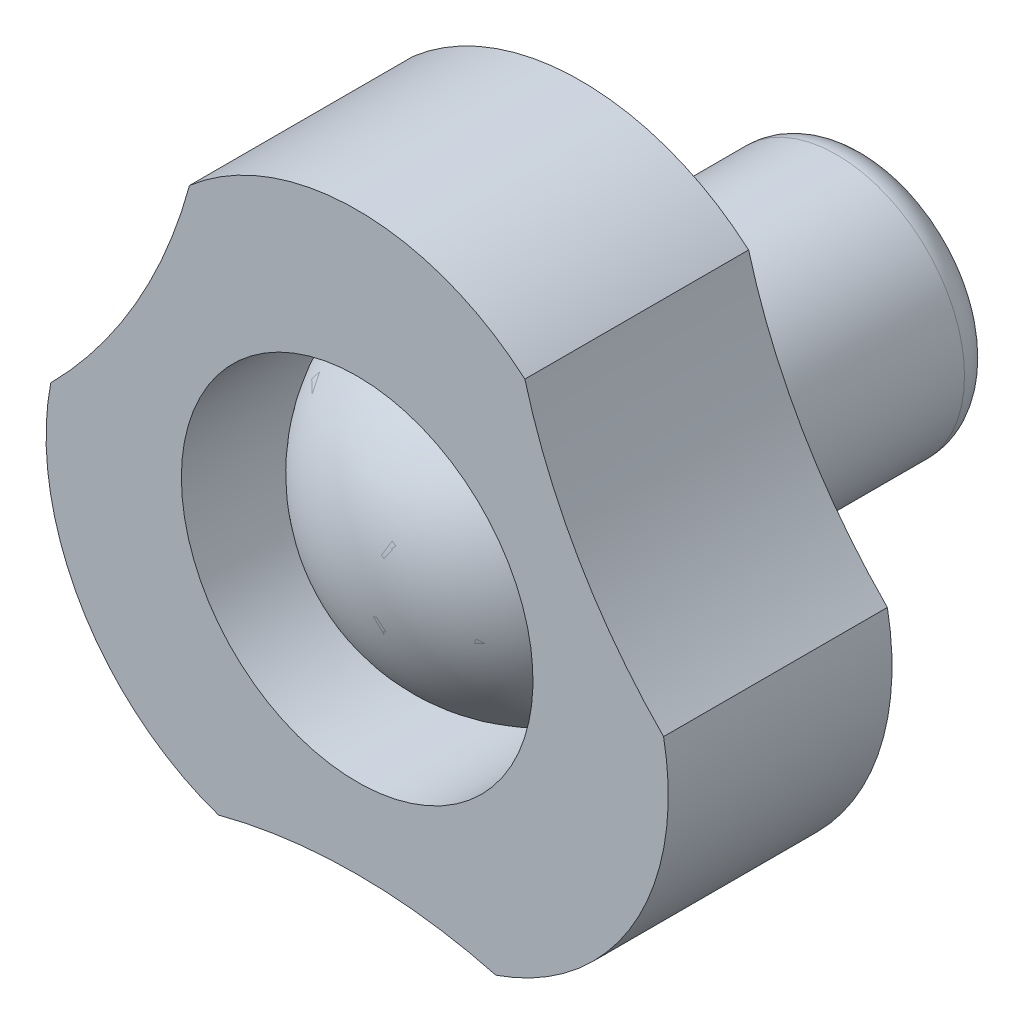
ISO-10303-21;
HEADER;
FILE_DESCRIPTION(('STEP AP214'),'2;1');
FILE_NAME('part.step','',(''),(''),'','','');
FILE_SCHEMA(('AUTOMOTIVE_DESIGN { 1 0 10303 214 1 1 1 1 }'));
ENDSEC;
DATA;
#1=APPLICATION_CONTEXT('core data for automotive mechanical design processes');
#2=APPLICATION_PROTOCOL_DEFINITION('international standard','automotive_design',2000,#1);
#3=PRODUCT_CONTEXT('',#1,'mechanical');
#4=PRODUCT('Part','Part','',(#3));
#5=PRODUCT_RELATED_PRODUCT_CATEGORY('part','',(#4));
#6=PRODUCT_DEFINITION_FORMATION('','',#4);
#7=PRODUCT_DEFINITION_CONTEXT('part definition',#1,'design');
#8=PRODUCT_DEFINITION('design','',#6,#7);
#9=PRODUCT_DEFINITION_SHAPE('','',#8);
#10=(LENGTH_UNIT() NAMED_UNIT(*) SI_UNIT(.MILLI.,.METRE.));
#11=(NAMED_UNIT(*) PLANE_ANGLE_UNIT() SI_UNIT($,.RADIAN.));
#12=(NAMED_UNIT(*) SI_UNIT($,.STERADIAN.) SOLID_ANGLE_UNIT());
#13=UNCERTAINTY_MEASURE_WITH_UNIT(LENGTH_MEASURE(1.E-05),#10,'distance_accuracy_value','');
#14=(GEOMETRIC_REPRESENTATION_CONTEXT(3) GLOBAL_UNCERTAINTY_ASSIGNED_CONTEXT((#13)) GLOBAL_UNIT_ASSIGNED_CONTEXT((#10,
#11,#12)) REPRESENTATION_CONTEXT('',''));
#15=CARTESIAN_POINT('',(0.,0.,0.));
#16=DIRECTION('',(0.,0.,1.));
#17=DIRECTION('',(1.,0.,0.));
#18=AXIS2_PLACEMENT_3D('',#15,#16,#17);
#19=CARTESIAN_POINT('',(0.,0.,-4.5));
#20=DIRECTION('',(0.,0.,1.));
#21=DIRECTION('',(0.,-1.,0.));
#22=AXIS2_PLACEMENT_3D('',#19,#20,#21);
#23=CYLINDRICAL_SURFACE('',#22,4.);
#24=CARTESIAN_POINT('',(0.,0.,-8.));
#25=DIRECTION('',(0.,0.,-1.));
#26=DIRECTION('',(0.,1.,0.));
#27=AXIS2_PLACEMENT_3D('',#24,#25,#26);
#28=CIRCLE('',#27,4.);
#29=CARTESIAN_POINT('',(0.,4.,-8.));
#30=VERTEX_POINT('',#29);
#31=EDGE_CURVE('P0_E12',#30,#30,#28,.F.);
#32=ORIENTED_EDGE('',*,*,#31,.T.);
#33=EDGE_LOOP('',(#32));
#34=FACE_BOUND('',#33,.T.);
#35=CARTESIAN_POINT('',(0.,0.,0.));
#36=DIRECTION('',(0.,0.,1.));
#37=DIRECTION('',(1.,0.,0.));
#38=AXIS2_PLACEMENT_3D('',#35,#36,#37);
#39=CIRCLE('',#38,4.);
#40=CARTESIAN_POINT('',(4.,0.,0.));
#41=VERTEX_POINT('',#40);
#42=EDGE_CURVE('P0_E160',#41,#41,#39,.F.);
#43=ORIENTED_EDGE('',*,*,#42,.T.);
#44=EDGE_LOOP('',(#43));
#45=FACE_BOUND('',#44,.T.);
#46=ADVANCED_FACE('P0_F54',(#34,#45),#23,.T.);
#47=CARTESIAN_POINT('',(0.,0.,-8.));
#48=DIRECTION('',(0.,0.,-1.));
#49=DIRECTION('',(0.,1.,0.));
#50=AXIS2_PLACEMENT_3D('',#47,#48,#49);
#51=TOROIDAL_SURFACE('',#50,3.,1.);
#52=CARTESIAN_POINT('',(0.,0.,-8.86602540378444));
#53=DIRECTION('',(0.,0.,-1.));
#54=DIRECTION('',(1.,0.,0.));
#55=AXIS2_PLACEMENT_3D('',#52,#53,#54);
#56=CIRCLE('',#55,3.5);
#57=CARTESIAN_POINT('',(3.5,0.,-8.86602540378444));
#58=VERTEX_POINT('',#57);
#59=EDGE_CURVE('P0_E168',#58,#58,#56,.T.);
#60=ORIENTED_EDGE('',*,*,#59,.F.);
#61=EDGE_LOOP('',(#60));
#62=FACE_BOUND('',#61,.T.);
#63=ORIENTED_EDGE('',*,*,#31,.F.);
#64=EDGE_LOOP('',(#63));
#65=FACE_BOUND('',#64,.T.);
#66=ADVANCED_FACE('P0_F200',(#62,#65),#51,.T.);
#67=CARTESIAN_POINT('',(0.,0.,-5.5));
#68=DIRECTION('',(0.,0.,-1.));
#69=DIRECTION('',(-1.,0.,0.));
#70=AXIS2_PLACEMENT_3D('',#67,#68,#69);
#71=CYLINDRICAL_SURFACE('',#70,3.5);
#72=CARTESIAN_POINT('',(0.,0.,-5.5));
#73=DIRECTION('',(0.,0.,-1.));
#74=DIRECTION('',(1.,0.,0.));
#75=AXIS2_PLACEMENT_3D('',#72,#73,#74);
#76=CIRCLE('',#75,3.5);
#77=CARTESIAN_POINT('',(3.5,0.,-5.5));
#78=VERTEX_POINT('',#77);
#79=EDGE_CURVE('P0_E63',#78,#78,#76,.T.);
#80=ORIENTED_EDGE('',*,*,#79,.F.);
#81=EDGE_LOOP('',(#80));
#82=FACE_BOUND('',#81,.T.);
#83=ORIENTED_EDGE('',*,*,#59,.T.);
#84=EDGE_LOOP('',(#83));
#85=FACE_BOUND('',#84,.T.);
#86=ADVANCED_FACE('P0_F207',(#82,#85),#71,.F.);
#87=CARTESIAN_POINT('',(0.,0.,-5.5));
#88=DIRECTION('',(0.,0.,1.));
#89=DIRECTION('',(1.,0.,0.));
#90=AXIS2_PLACEMENT_3D('',#87,#88,#89);
#91=PLANE('',#90);
#92=ORIENTED_EDGE('',*,*,#79,.T.);
#93=EDGE_LOOP('',(#92));
#94=FACE_BOUND('',#93,.T.);
#95=ADVANCED_FACE('P0_F197',(#94),#91,.F.);
#96=CARTESIAN_POINT('',(1.73205080756888,-1.,7.));
#97=DIRECTION('',(0.,0.,-1.));
#98=DIRECTION('',(-1.,0.,0.));
#99=AXIS2_PLACEMENT_3D('',#96,#97,#98);
#100=CYLINDRICAL_SURFACE('',#99,7.99999999999999);
#101=CARTESIAN_POINT('',(1.73205080756888,-1.,0.));
#102=DIRECTION('',(0.,0.,-1.));
#103=DIRECTION('',(-1.,0.,0.));
#104=AXIS2_PLACEMENT_3D('',#101,#102,#103);
#105=CIRCLE('',#104,7.99999999999999);
#106=CARTESIAN_POINT('',(9.58564005783161,0.523527449098806,0.));
#107=VERTEX_POINT('',#106);
#108=CARTESIAN_POINT('',(4.33943195841778,-8.56317152616532,0.));
#109=VERTEX_POINT('',#108);
#110=EDGE_CURVE('P0_E142',#107,#109,#105,.T.);
#111=ORIENTED_EDGE('',*,*,#110,.F.);
#112=DIRECTION('',(0.,0.,-1.));
#113=VECTOR('',#112,1.);
#114=CARTESIAN_POINT('',(9.58564005783161,0.523527449098806,7.));
#115=LINE('',#114,#113);
#116=CARTESIAN_POINT('',(9.58564005783161,0.523527449098806,7.));
#117=VERTEX_POINT('',#116);
#118=EDGE_CURVE('P0_E71',#117,#107,#115,.T.);
#119=ORIENTED_EDGE('',*,*,#118,.F.);
#120=CARTESIAN_POINT('',(1.73205080756888,-1.,7.));
#121=DIRECTION('',(0.,0.,-1.));
#122=DIRECTION('',(-1.,0.,0.));
#123=AXIS2_PLACEMENT_3D('',#120,#121,#122);
#124=CIRCLE('',#123,7.99999999999999);
#125=CARTESIAN_POINT('',(4.33943195841778,-8.56317152616532,7.));
#126=VERTEX_POINT('',#125);
#127=EDGE_CURVE('P0_E158',#117,#126,#124,.T.);
#128=ORIENTED_EDGE('',*,*,#127,.T.);
#129=DIRECTION('',(0.,0.,-1.));
#130=VECTOR('',#129,1.);
#131=CARTESIAN_POINT('',(4.33943195841778,-8.56317152616532,7.));
#132=LINE('',#131,#130);
#133=EDGE_CURVE('P0_E106',#126,#109,#132,.T.);
#134=ORIENTED_EDGE('',*,*,#133,.T.);
#135=EDGE_LOOP('',(#111,#119,#128,#134));
#136=FACE_BOUND('',#135,.T.);
#137=ADVANCED_FACE('P0_F184',(#136),#100,.T.);
#138=CARTESIAN_POINT('',(21.650635094611,12.5,7.));
#139=DIRECTION('',(0.,0.,-1.));
#140=DIRECTION('',(-1.,0.,0.));
#141=AXIS2_PLACEMENT_3D('',#138,#139,#140);
#142=CYLINDRICAL_SURFACE('',#141,17.);
#143=CARTESIAN_POINT('',(21.650635094611,12.5,0.));
#144=DIRECTION('',(0.,0.,1.));
#145=DIRECTION('',(1.,0.,0.));
#146=AXIS2_PLACEMENT_3D('',#143,#144,#145);
#147=CIRCLE('',#146,17.);
#148=CARTESIAN_POINT('',(5.24620809941384,8.03964407706651,0.));
#149=VERTEX_POINT('',#148);
#150=EDGE_CURVE('P0_E155',#149,#107,#147,.T.);
#151=ORIENTED_EDGE('',*,*,#150,.F.);
#152=DIRECTION('',(0.,0.,-1.));
#153=VECTOR('',#152,1.);
#154=CARTESIAN_POINT('',(5.24620809941384,8.03964407706651,7.));
#155=LINE('',#154,#153);
#156=CARTESIAN_POINT('',(5.24620809941384,8.03964407706651,7.));
#157=VERTEX_POINT('',#156);
#158=EDGE_CURVE('P0_E94',#157,#149,#155,.T.);
#159=ORIENTED_EDGE('',*,*,#158,.F.);
#160=CARTESIAN_POINT('',(21.650635094611,12.5,7.));
#161=DIRECTION('',(0.,0.,1.));
#162=DIRECTION('',(1.,0.,0.));
#163=AXIS2_PLACEMENT_3D('',#160,#161,#162);
#164=CIRCLE('',#163,17.);
#165=EDGE_CURVE('P0_E132',#157,#117,#164,.T.);
#166=ORIENTED_EDGE('',*,*,#165,.T.);
#167=ORIENTED_EDGE('',*,*,#118,.T.);
#168=EDGE_LOOP('',(#151,#159,#166,#167));
#169=FACE_BOUND('',#168,.T.);
#170=ADVANCED_FACE('P0_F189',(#169),#142,.F.);
#171=CARTESIAN_POINT('',(0.,2.,7.));
#172=DIRECTION('',(0.,0.,-1.));
#173=DIRECTION('',(-1.,0.,0.));
#174=AXIS2_PLACEMENT_3D('',#171,#172,#173);
#175=CYLINDRICAL_SURFACE('',#174,8.);
#176=CARTESIAN_POINT('',(0.,2.,0.));
#177=DIRECTION('',(0.,0.,-1.));
#178=DIRECTION('',(-1.,0.,0.));
#179=AXIS2_PLACEMENT_3D('',#176,#177,#178);
#180=CIRCLE('',#179,8.);
#181=CARTESIAN_POINT('',(-5.24620809941385,8.0396440770665,0.));
#182=VERTEX_POINT('',#181);
#183=EDGE_CURVE('P0_E119',#182,#149,#180,.T.);
#184=ORIENTED_EDGE('',*,*,#183,.F.);
#185=DIRECTION('',(0.,0.,-1.));
#186=VECTOR('',#185,1.);
#187=CARTESIAN_POINT('',(-5.24620809941385,8.0396440770665,7.));
#188=LINE('',#187,#186);
#189=CARTESIAN_POINT('',(-5.24620809941385,8.0396440770665,7.));
#190=VERTEX_POINT('',#189);
#191=EDGE_CURVE('P0_E114',#190,#182,#188,.T.);
#192=ORIENTED_EDGE('',*,*,#191,.F.);
#193=CARTESIAN_POINT('',(0.,2.,7.));
#194=DIRECTION('',(0.,0.,-1.));
#195=DIRECTION('',(-1.,0.,0.));
#196=AXIS2_PLACEMENT_3D('',#193,#194,#195);
#197=CIRCLE('',#196,8.);
#198=EDGE_CURVE('P0_E117',#190,#157,#197,.T.);
#199=ORIENTED_EDGE('',*,*,#198,.T.);
#200=ORIENTED_EDGE('',*,*,#158,.T.);
#201=EDGE_LOOP('',(#184,#192,#199,#200));
#202=FACE_BOUND('',#201,.T.);
#203=ADVANCED_FACE('P0_F116',(#202),#175,.T.);
#204=CARTESIAN_POINT('',(-21.6506350946109,12.5,7.));
#205=DIRECTION('',(0.,0.,-1.));
#206=DIRECTION('',(-1.,0.,0.));
#207=AXIS2_PLACEMENT_3D('',#204,#205,#206);
#208=CYLINDRICAL_SURFACE('',#207,17.);
#209=CARTESIAN_POINT('',(-21.6506350946109,12.5,0.));
#210=DIRECTION('',(0.,0.,1.));
#211=DIRECTION('',(1.,0.,0.));
#212=AXIS2_PLACEMENT_3D('',#209,#210,#211);
#213=CIRCLE('',#212,17.);
#214=CARTESIAN_POINT('',(-9.58564005783162,0.523527449098812,0.));
#215=VERTEX_POINT('',#214);
#216=EDGE_CURVE('P0_E152',#215,#182,#213,.T.);
#217=ORIENTED_EDGE('',*,*,#216,.F.);
#218=DIRECTION('',(0.,0.,-1.));
#219=VECTOR('',#218,1.);
#220=CARTESIAN_POINT('',(-9.58564005783162,0.523527449098812,7.));
#221=LINE('',#220,#219);
#222=CARTESIAN_POINT('',(-9.58564005783162,0.523527449098812,7.));
#223=VERTEX_POINT('',#222);
#224=EDGE_CURVE('P0_E124',#223,#215,#221,.T.);
#225=ORIENTED_EDGE('',*,*,#224,.F.);
#226=CARTESIAN_POINT('',(-21.6506350946109,12.5,7.));
#227=DIRECTION('',(0.,0.,1.));
#228=DIRECTION('',(1.,0.,0.));
#229=AXIS2_PLACEMENT_3D('',#226,#227,#228);
#230=CIRCLE('',#229,17.);
#231=EDGE_CURVE('P0_E130',#223,#190,#230,.T.);
#232=ORIENTED_EDGE('',*,*,#231,.T.);
#233=ORIENTED_EDGE('',*,*,#191,.T.);
#234=EDGE_LOOP('',(#217,#225,#232,#233));
#235=FACE_BOUND('',#234,.T.);
#236=ADVANCED_FACE('P0_F134',(#235),#208,.F.);
#237=CARTESIAN_POINT('',(-1.73205080756888,-1.,7.));
#238=DIRECTION('',(0.,0.,-1.));
#239=DIRECTION('',(-1.,0.,0.));
#240=AXIS2_PLACEMENT_3D('',#237,#238,#239);
#241=CYLINDRICAL_SURFACE('',#240,8.);
#242=CARTESIAN_POINT('',(-1.73205080756888,-1.,0.));
#243=DIRECTION('',(0.,0.,-1.));
#244=DIRECTION('',(-1.,0.,0.));
#245=AXIS2_PLACEMENT_3D('',#242,#243,#244);
#246=CIRCLE('',#245,8.);
#247=CARTESIAN_POINT('',(-4.33943195841777,-8.56317152616532,0.));
#248=VERTEX_POINT('',#247);
#249=EDGE_CURVE('P0_E149',#248,#215,#246,.T.);
#250=ORIENTED_EDGE('',*,*,#249,.F.);
#251=DIRECTION('',(0.,0.,-1.));
#252=VECTOR('',#251,1.);
#253=CARTESIAN_POINT('',(-4.33943195841777,-8.56317152616532,7.));
#254=LINE('',#253,#252);
#255=CARTESIAN_POINT('',(-4.33943195841777,-8.56317152616532,7.));
#256=VERTEX_POINT('',#255);
#257=EDGE_CURVE('P0_E163',#256,#248,#254,.T.);
#258=ORIENTED_EDGE('',*,*,#257,.F.);
#259=CARTESIAN_POINT('',(-1.73205080756888,-1.,7.));
#260=DIRECTION('',(0.,0.,-1.));
#261=DIRECTION('',(-1.,0.,0.));
#262=AXIS2_PLACEMENT_3D('',#259,#260,#261);
#263=CIRCLE('',#262,8.);
#264=EDGE_CURVE('P0_E135',#256,#223,#263,.T.);
#265=ORIENTED_EDGE('',*,*,#264,.T.);
#266=ORIENTED_EDGE('',*,*,#224,.T.);
#267=EDGE_LOOP('',(#250,#258,#265,#266));
#268=FACE_BOUND('',#267,.T.);
#269=ADVANCED_FACE('P0_F188',(#268),#241,.T.);
#270=CARTESIAN_POINT('',(0.,-25.,7.));
#271=DIRECTION('',(0.,0.,-1.));
#272=DIRECTION('',(-1.,0.,0.));
#273=AXIS2_PLACEMENT_3D('',#270,#271,#272);
#274=CYLINDRICAL_SURFACE('',#273,17.);
#275=CARTESIAN_POINT('',(0.,-25.,0.));
#276=DIRECTION('',(0.,0.,1.));
#277=DIRECTION('',(1.,0.,0.));
#278=AXIS2_PLACEMENT_3D('',#275,#276,#277);
#279=CIRCLE('',#278,17.);
#280=EDGE_CURVE('P0_E145',#109,#248,#279,.T.);
#281=ORIENTED_EDGE('',*,*,#280,.F.);
#282=ORIENTED_EDGE('',*,*,#133,.F.);
#283=CARTESIAN_POINT('',(0.,-25.,7.));
#284=DIRECTION('',(0.,0.,1.));
#285=DIRECTION('',(1.,0.,0.));
#286=AXIS2_PLACEMENT_3D('',#283,#284,#285);
#287=CIRCLE('',#286,17.);
#288=EDGE_CURVE('P0_E137',#126,#256,#287,.T.);
#289=ORIENTED_EDGE('',*,*,#288,.T.);
#290=ORIENTED_EDGE('',*,*,#257,.T.);
#291=EDGE_LOOP('',(#281,#282,#289,#290));
#292=FACE_BOUND('',#291,.T.);
#293=ADVANCED_FACE('P0_F185',(#292),#274,.F.);
#294=CARTESIAN_POINT('',(0.866025403784439,-13.,7.));
#295=DIRECTION('',(0.,0.,-1.));
#296=DIRECTION('',(-1.,0.,0.));
#297=AXIS2_PLACEMENT_3D('',#294,#295,#296);
#298=PLANE('',#297);
#299=CARTESIAN_POINT('',(0.,0.,7.));
#300=DIRECTION('',(0.,0.,1.));
#301=DIRECTION('',(-1.,0.,0.));
#302=AXIS2_PLACEMENT_3D('',#299,#300,#301);
#303=CIRCLE('',#302,5.5);
#304=CARTESIAN_POINT('',(-5.5,0.,7.));
#305=VERTEX_POINT('',#304);
#306=EDGE_CURVE('P0_E338',#305,#305,#303,.T.);
#307=ORIENTED_EDGE('',*,*,#306,.F.);
#308=EDGE_LOOP('',(#307));
#309=FACE_BOUND('',#308,.T.);
#310=ORIENTED_EDGE('',*,*,#127,.F.);
#311=ORIENTED_EDGE('',*,*,#165,.F.);
#312=ORIENTED_EDGE('',*,*,#198,.F.);
#313=ORIENTED_EDGE('',*,*,#231,.F.);
#314=ORIENTED_EDGE('',*,*,#264,.F.);
#315=ORIENTED_EDGE('',*,*,#288,.F.);
#316=EDGE_LOOP('',(#310,#311,#312,#313,#314,#315));
#317=FACE_BOUND('',#316,.T.);
#318=ADVANCED_FACE('P0_F128',(#309,#317),#298,.F.);
#319=CARTESIAN_POINT('',(0.866025403784439,-13.,0.));
#320=DIRECTION('',(0.,0.,-1.));
#321=DIRECTION('',(-1.,0.,0.));
#322=AXIS2_PLACEMENT_3D('',#319,#320,#321);
#323=PLANE('',#322);
#324=ORIENTED_EDGE('',*,*,#42,.F.);
#325=EDGE_LOOP('',(#324));
#326=FACE_BOUND('',#325,.T.);
#327=ORIENTED_EDGE('',*,*,#110,.T.);
#328=ORIENTED_EDGE('',*,*,#280,.T.);
#329=ORIENTED_EDGE('',*,*,#249,.T.);
#330=ORIENTED_EDGE('',*,*,#216,.T.);
#331=ORIENTED_EDGE('',*,*,#183,.T.);
#332=ORIENTED_EDGE('',*,*,#150,.T.);
#333=EDGE_LOOP('',(#327,#328,#329,#330,#331,#332));
#334=FACE_BOUND('',#333,.T.);
#335=ADVANCED_FACE('P0_F179',(#326,#334),#323,.T.);
#336=CARTESIAN_POINT('',(0.,0.,1.25797101449275));
#337=DIRECTION('',(0.,0.,1.));
#338=DIRECTION('',(0.,1.,0.));
#339=AXIS2_PLACEMENT_3D('',#336,#337,#338);
#340=SPHERICAL_SURFACE('',#339,5.64202898550725);
#341=CARTESIAN_POINT('',(0.,0.,2.51594202898552));
#342=DIRECTION('',(0.,0.,-1.));
#343=DIRECTION('',(0.,1.,0.));
#344=AXIS2_PLACEMENT_3D('',#341,#342,#343);
#345=CIRCLE('',#344,5.5);
#346=CARTESIAN_POINT('',(0.,5.5,2.51594202898552));
#347=VERTEX_POINT('',#346);
#348=EDGE_CURVE('P0_E146',#347,#347,#345,.F.);
#349=ORIENTED_EDGE('',*,*,#348,.T.);
#350=EDGE_LOOP('',(#349));
#351=FACE_BOUND('',#350,.T.);
#352=ADVANCED_FACE('P0_F182',(#351),#340,.T.);
#353=CARTESIAN_POINT('',(0.,0.,-8.86702540378444));
#354=DIRECTION('',(0.,0.,1.));
#355=DIRECTION('',(1.,0.,0.));
#356=AXIS2_PLACEMENT_3D('',#353,#354,#355);
#357=CYLINDRICAL_SURFACE('',#356,5.5);
#358=ORIENTED_EDGE('',*,*,#306,.T.);
#359=EDGE_LOOP('',(#358));
#360=FACE_BOUND('',#359,.T.);
#361=ORIENTED_EDGE('',*,*,#348,.F.);
#362=EDGE_LOOP('',(#361));
#363=FACE_BOUND('',#362,.T.);
#364=ADVANCED_FACE('P0_F259',(#360,#363),#357,.F.);
#365=CLOSED_SHELL('',(#46,#66,#86,#95,#137,#170,#203,#236,#269,#293,#318,#335,#352,#364));
#366=MANIFOLD_SOLID_BREP('P0_B2',#365);
#367=CARTESIAN_POINT('',(0.,0.,1.25797101449275));
#368=DIRECTION('',(0.,0.,1.));
#369=DIRECTION('',(0.,1.,0.));
#370=AXIS2_PLACEMENT_3D('',#367,#368,#369);
#371=SPHERICAL_SURFACE('',#370,5.64202898550725);
#372=CARTESIAN_POINT('',(0.,0.,2.51594202898552));
#373=DIRECTION('',(0.,0.,-1.));
#374=DIRECTION('',(0.,1.,0.));
#375=AXIS2_PLACEMENT_3D('',#372,#373,#374);
#376=CIRCLE('',#375,5.5);
#377=CARTESIAN_POINT('',(0.,5.5,2.51594202898552));
#378=VERTEX_POINT('',#377);
#379=EDGE_CURVE('P1_E10',#378,#378,#376,.F.);
#380=ORIENTED_EDGE('',*,*,#379,.F.);
#381=EDGE_LOOP('',(#380));
#382=FACE_BOUND('',#381,.T.);
#383=ADVANCED_FACE('P1_F15',(#382),#371,.F.);
#384=OPEN_SHELL('',(#383));
#385=SHELL_BASED_SURFACE_MODEL('P1_B1',(#384));
#386=ADVANCED_BREP_SHAPE_REPRESENTATION('',(#18,#366),#14);
#387=MANIFOLD_SURFACE_SHAPE_REPRESENTATION('',(#18,#385),#14);
#388=SHAPE_REPRESENTATION('',(#18),#14);
#389=SHAPE_DEFINITION_REPRESENTATION(#9,#388);
#390=SHAPE_REPRESENTATION_RELATIONSHIP('','',#388,#386);
#391=SHAPE_REPRESENTATION_RELATIONSHIP('','',#388,#387);
ENDSEC;
END-ISO-10303-21;
